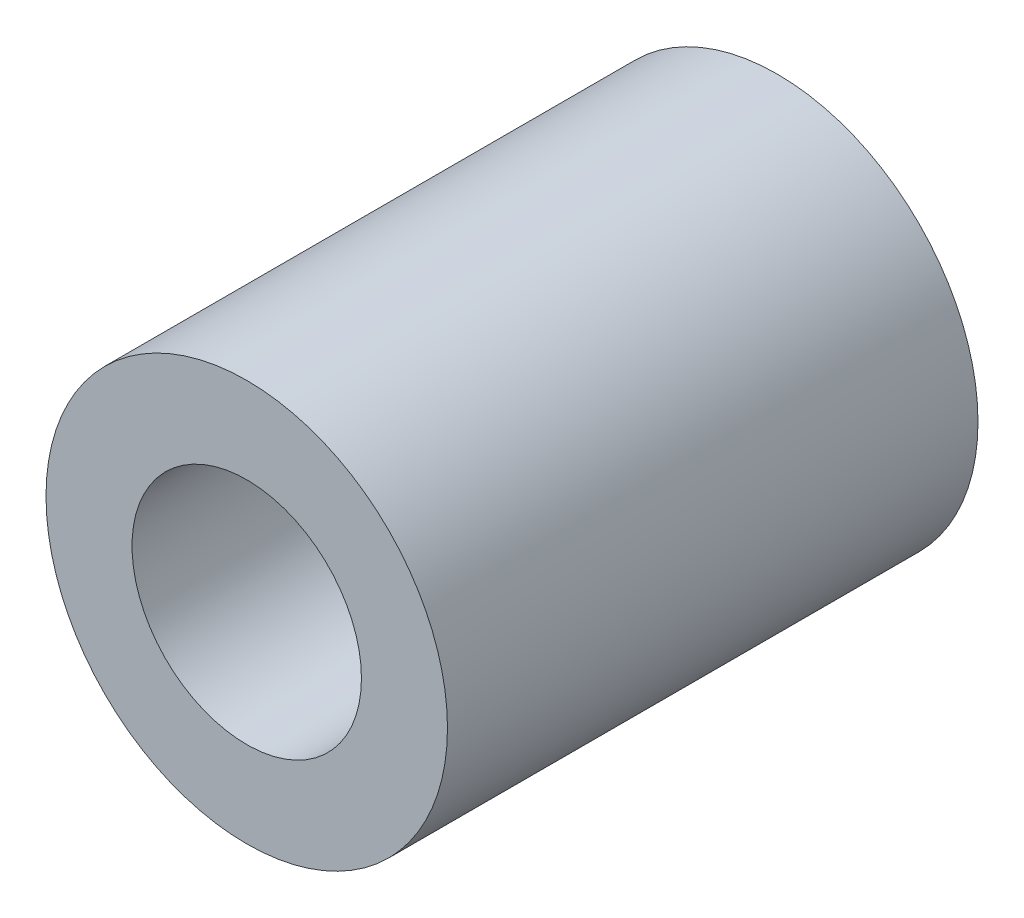
ISO-10303-21;
HEADER;
FILE_DESCRIPTION(('STEP AP214'),'2;1');
FILE_NAME('part.step','',(''),(''),'','','');
FILE_SCHEMA(('AUTOMOTIVE_DESIGN { 1 0 10303 214 1 1 1 1 }'));
ENDSEC;
DATA;
#1=APPLICATION_CONTEXT('core data for automotive mechanical design processes');
#2=APPLICATION_PROTOCOL_DEFINITION('international standard','automotive_design',2000,#1);
#3=PRODUCT_CONTEXT('',#1,'mechanical');
#4=PRODUCT('Part','Part','',(#3));
#5=PRODUCT_RELATED_PRODUCT_CATEGORY('part','',(#4));
#6=PRODUCT_DEFINITION_FORMATION('','',#4);
#7=PRODUCT_DEFINITION_CONTEXT('part definition',#1,'design');
#8=PRODUCT_DEFINITION('design','',#6,#7);
#9=PRODUCT_DEFINITION_SHAPE('','',#8);
#10=(LENGTH_UNIT() NAMED_UNIT(*) SI_UNIT(.MILLI.,.METRE.));
#11=(NAMED_UNIT(*) PLANE_ANGLE_UNIT() SI_UNIT($,.RADIAN.));
#12=(NAMED_UNIT(*) SI_UNIT($,.STERADIAN.) SOLID_ANGLE_UNIT());
#13=UNCERTAINTY_MEASURE_WITH_UNIT(LENGTH_MEASURE(1.E-05),#10,'distance_accuracy_value','');
#14=(GEOMETRIC_REPRESENTATION_CONTEXT(3) GLOBAL_UNCERTAINTY_ASSIGNED_CONTEXT((#13)) GLOBAL_UNIT_ASSIGNED_CONTEXT((#10,
#11,#12)) REPRESENTATION_CONTEXT('',''));
#15=CARTESIAN_POINT('',(0.,0.,0.));
#16=DIRECTION('',(0.,0.,1.));
#17=DIRECTION('',(1.,0.,0.));
#18=AXIS2_PLACEMENT_3D('',#15,#16,#17);
#19=CARTESIAN_POINT('',(0.,0.,37.));
#20=DIRECTION('',(0.,0.,1.));
#21=DIRECTION('',(1.,0.,0.));
#22=AXIS2_PLACEMENT_3D('',#19,#20,#21);
#23=PLANE('',#22);
#24=CARTESIAN_POINT('',(0.,0.,37.));
#25=DIRECTION('',(0.,0.,1.));
#26=DIRECTION('',(1.,0.,0.));
#27=AXIS2_PLACEMENT_3D('',#24,#25,#26);
#28=CIRCLE('',#27,14.);
#29=CARTESIAN_POINT('',(14.,0.,37.));
#30=VERTEX_POINT('',#29);
#31=EDGE_CURVE('E10',#30,#30,#28,.T.);
#32=ORIENTED_EDGE('',*,*,#31,.T.);
#33=EDGE_LOOP('',(#32));
#34=FACE_BOUND('',#33,.T.);
#35=CARTESIAN_POINT('',(0.,0.,37.));
#36=DIRECTION('',(0.,0.,1.));
#37=DIRECTION('',(1.,0.,0.));
#38=AXIS2_PLACEMENT_3D('',#35,#36,#37);
#39=CIRCLE('',#38,8.);
#40=CARTESIAN_POINT('',(8.,0.,37.));
#41=VERTEX_POINT('',#40);
#42=EDGE_CURVE('E44',#41,#41,#39,.T.);
#43=ORIENTED_EDGE('',*,*,#42,.F.);
#44=EDGE_LOOP('',(#43));
#45=FACE_BOUND('',#44,.T.);
#46=ADVANCED_FACE('F33',(#34,#45),#23,.T.);
#47=CARTESIAN_POINT('',(0.,0.,0.));
#48=DIRECTION('',(0.,0.,1.));
#49=DIRECTION('',(1.,0.,0.));
#50=AXIS2_PLACEMENT_3D('',#47,#48,#49);
#51=PLANE('',#50);
#52=CARTESIAN_POINT('',(0.,0.,0.));
#53=DIRECTION('',(0.,0.,1.));
#54=DIRECTION('',(1.,0.,0.));
#55=AXIS2_PLACEMENT_3D('',#52,#53,#54);
#56=CIRCLE('',#55,14.);
#57=CARTESIAN_POINT('',(14.,0.,0.));
#58=VERTEX_POINT('',#57);
#59=EDGE_CURVE('E37',#58,#58,#56,.T.);
#60=ORIENTED_EDGE('',*,*,#59,.F.);
#61=EDGE_LOOP('',(#60));
#62=FACE_BOUND('',#61,.T.);
#63=CARTESIAN_POINT('',(0.,0.,0.));
#64=DIRECTION('',(0.,0.,1.));
#65=DIRECTION('',(1.,0.,0.));
#66=AXIS2_PLACEMENT_3D('',#63,#64,#65);
#67=CIRCLE('',#66,8.);
#68=CARTESIAN_POINT('',(8.,0.,0.));
#69=VERTEX_POINT('',#68);
#70=EDGE_CURVE('E46',#69,#69,#67,.T.);
#71=ORIENTED_EDGE('',*,*,#70,.T.);
#72=EDGE_LOOP('',(#71));
#73=FACE_BOUND('',#72,.T.);
#74=ADVANCED_FACE('F56',(#62,#73),#51,.F.);
#75=CARTESIAN_POINT('',(0.,0.,37.));
#76=DIRECTION('',(0.,0.,-1.));
#77=DIRECTION('',(-1.,0.,0.));
#78=AXIS2_PLACEMENT_3D('',#75,#76,#77);
#79=CYLINDRICAL_SURFACE('',#78,14.);
#80=ORIENTED_EDGE('',*,*,#31,.F.);
#81=EDGE_LOOP('',(#80));
#82=FACE_BOUND('',#81,.T.);
#83=ORIENTED_EDGE('',*,*,#59,.T.);
#84=EDGE_LOOP('',(#83));
#85=FACE_BOUND('',#84,.T.);
#86=ADVANCED_FACE('F35',(#82,#85),#79,.T.);
#87=CARTESIAN_POINT('',(0.,0.,37.));
#88=DIRECTION('',(0.,0.,-1.));
#89=DIRECTION('',(-1.,0.,0.));
#90=AXIS2_PLACEMENT_3D('',#87,#88,#89);
#91=CYLINDRICAL_SURFACE('',#90,8.);
#92=ORIENTED_EDGE('',*,*,#42,.T.);
#93=EDGE_LOOP('',(#92));
#94=FACE_BOUND('',#93,.T.);
#95=ORIENTED_EDGE('',*,*,#70,.F.);
#96=EDGE_LOOP('',(#95));
#97=FACE_BOUND('',#96,.T.);
#98=ADVANCED_FACE('F52',(#94,#97),#91,.F.);
#99=CLOSED_SHELL('',(#46,#74,#86,#98));
#100=MANIFOLD_SOLID_BREP('B2',#99);
#101=ADVANCED_BREP_SHAPE_REPRESENTATION('',(#18,#100),#14);
#102=SHAPE_DEFINITION_REPRESENTATION(#9,#101);
ENDSEC;
END-ISO-10303-21;
